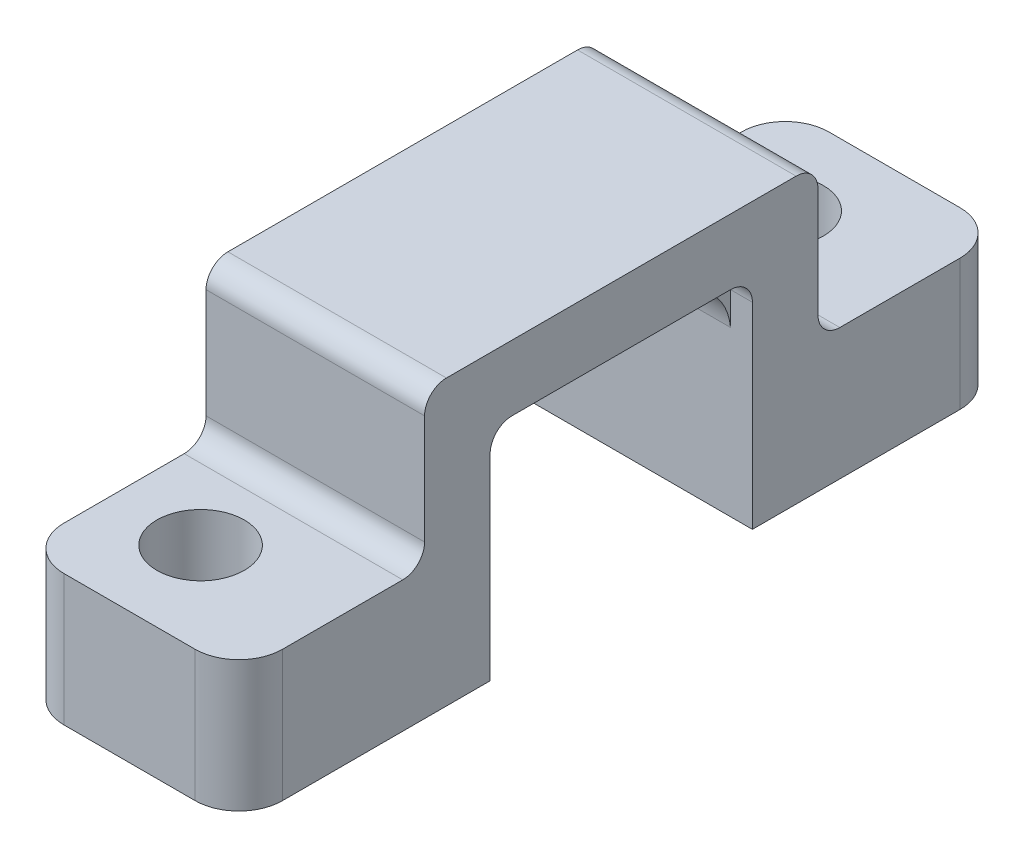
ISO-10303-21;
HEADER;
FILE_DESCRIPTION(('STEP AP214'),'2;1');
FILE_NAME('part.step','',(''),(''),'','','');
FILE_SCHEMA(('AUTOMOTIVE_DESIGN { 1 0 10303 214 1 1 1 1 }'));
ENDSEC;
DATA;
#1=APPLICATION_CONTEXT('core data for automotive mechanical design processes');
#2=APPLICATION_PROTOCOL_DEFINITION('international standard','automotive_design',2000,#1);
#3=PRODUCT_CONTEXT('',#1,'mechanical');
#4=PRODUCT('Part','Part','',(#3));
#5=PRODUCT_RELATED_PRODUCT_CATEGORY('part','',(#4));
#6=PRODUCT_DEFINITION_FORMATION('','',#4);
#7=PRODUCT_DEFINITION_CONTEXT('part definition',#1,'design');
#8=PRODUCT_DEFINITION('design','',#6,#7);
#9=PRODUCT_DEFINITION_SHAPE('','',#8);
#10=(LENGTH_UNIT() NAMED_UNIT(*) SI_UNIT(.MILLI.,.METRE.));
#11=(NAMED_UNIT(*) PLANE_ANGLE_UNIT() SI_UNIT($,.RADIAN.));
#12=(NAMED_UNIT(*) SI_UNIT($,.STERADIAN.) SOLID_ANGLE_UNIT());
#13=UNCERTAINTY_MEASURE_WITH_UNIT(LENGTH_MEASURE(1.E-05),#10,'distance_accuracy_value','');
#14=(GEOMETRIC_REPRESENTATION_CONTEXT(3) GLOBAL_UNCERTAINTY_ASSIGNED_CONTEXT((#13)) GLOBAL_UNIT_ASSIGNED_CONTEXT((#10,
#11,#12)) REPRESENTATION_CONTEXT('',''));
#15=CARTESIAN_POINT('',(0.,0.,0.));
#16=DIRECTION('',(0.,0.,1.));
#17=DIRECTION('',(1.,0.,0.));
#18=AXIS2_PLACEMENT_3D('',#15,#16,#17);
#19=CARTESIAN_POINT('',(-5.,10.,-14.));
#20=DIRECTION('',(0.,1.,0.));
#21=DIRECTION('',(0.,0.,1.));
#22=AXIS2_PLACEMENT_3D('',#19,#20,#21);
#23=PLANE('',#22);
#24=DIRECTION('',(0.,0.,-1.));
#25=VECTOR('',#24,1.);
#26=CARTESIAN_POINT('',(0.,10.,0.));
#27=LINE('',#26,#25);
#28=CARTESIAN_POINT('',(0.,10.,-3.46480602147619));
#29=VERTEX_POINT('',#28);
#30=CARTESIAN_POINT('',(0.,10.,-5.));
#31=VERTEX_POINT('',#30);
#32=EDGE_CURVE('E309',#29,#31,#27,.T.);
#33=ORIENTED_EDGE('',*,*,#32,.F.);
#34=DIRECTION('',(1.,0.,0.));
#35=VECTOR('',#34,1.);
#36=CARTESIAN_POINT('',(0.,10.,-3.46480602147619));
#37=LINE('',#36,#35);
#38=CARTESIAN_POINT('',(4.,10.,-3.46480602147619));
#39=VERTEX_POINT('',#38);
#40=EDGE_CURVE('E318',#29,#39,#37,.T.);
#41=ORIENTED_EDGE('',*,*,#40,.T.);
#42=DIRECTION('',(0.,0.,-1.));
#43=VECTOR('',#42,1.);
#44=CARTESIAN_POINT('',(4.,10.,0.));
#45=LINE('',#44,#43);
#46=CARTESIAN_POINT('',(4.,10.,-5.));
#47=VERTEX_POINT('',#46);
#48=EDGE_CURVE('E306',#39,#47,#45,.T.);
#49=ORIENTED_EDGE('',*,*,#48,.T.);
#50=DIRECTION('',(-1.,0.,0.));
#51=VECTOR('',#50,1.);
#52=CARTESIAN_POINT('',(5.,10.,-5.));
#53=LINE('',#52,#51);
#54=CARTESIAN_POINT('',(5.,10.,-5.));
#55=VERTEX_POINT('',#54);
#56=EDGE_CURVE('E385',#47,#55,#53,.F.);
#57=ORIENTED_EDGE('',*,*,#56,.T.);
#58=DIRECTION('',(0.,0.,1.));
#59=VECTOR('',#58,1.);
#60=CARTESIAN_POINT('',(5.,10.,-14.));
#61=LINE('',#60,#59);
#62=CARTESIAN_POINT('',(5.,10.,5.));
#63=VERTEX_POINT('',#62);
#64=EDGE_CURVE('E354',#55,#63,#61,.T.);
#65=ORIENTED_EDGE('',*,*,#64,.T.);
#66=DIRECTION('',(-1.,0.,0.));
#67=VECTOR('',#66,1.);
#68=CARTESIAN_POINT('',(-5.,10.,5.));
#69=LINE('',#68,#67);
#70=CARTESIAN_POINT('',(4.,10.,5.));
#71=VERTEX_POINT('',#70);
#72=EDGE_CURVE('E382',#63,#71,#69,.T.);
#73=ORIENTED_EDGE('',*,*,#72,.T.);
#74=DIRECTION('',(0.,0.,-1.));
#75=VECTOR('',#74,1.);
#76=CARTESIAN_POINT('',(4.,10.,0.));
#77=LINE('',#76,#75);
#78=CARTESIAN_POINT('',(4.,10.,3.46480602147619));
#79=VERTEX_POINT('',#78);
#80=EDGE_CURVE('E326',#71,#79,#77,.T.);
#81=ORIENTED_EDGE('',*,*,#80,.T.);
#82=DIRECTION('',(1.,0.,0.));
#83=VECTOR('',#82,1.);
#84=CARTESIAN_POINT('',(0.,10.,3.46480602147619));
#85=LINE('',#84,#83);
#86=CARTESIAN_POINT('',(0.,10.,3.46480602147619));
#87=VERTEX_POINT('',#86);
#88=EDGE_CURVE('E339',#87,#79,#85,.T.);
#89=ORIENTED_EDGE('',*,*,#88,.F.);
#90=DIRECTION('',(0.,0.,-1.));
#91=VECTOR('',#90,1.);
#92=CARTESIAN_POINT('',(0.,10.,0.));
#93=LINE('',#92,#91);
#94=CARTESIAN_POINT('',(0.,10.,5.));
#95=VERTEX_POINT('',#94);
#96=EDGE_CURVE('E329',#95,#87,#93,.T.);
#97=ORIENTED_EDGE('',*,*,#96,.F.);
#98=CARTESIAN_POINT('',(-5.,10.,5.));
#99=VERTEX_POINT('',#98);
#100=EDGE_CURVE('E381',#95,#99,#69,.T.);
#101=ORIENTED_EDGE('',*,*,#100,.T.);
#102=DIRECTION('',(0.,0.,1.));
#103=VECTOR('',#102,1.);
#104=CARTESIAN_POINT('',(-5.,10.,-14.));
#105=LINE('',#104,#103);
#106=CARTESIAN_POINT('',(-5.,10.,-5.));
#107=VERTEX_POINT('',#106);
#108=EDGE_CURVE('E357',#107,#99,#105,.T.);
#109=ORIENTED_EDGE('',*,*,#108,.F.);
#110=EDGE_CURVE('E386',#107,#31,#53,.F.);
#111=ORIENTED_EDGE('',*,*,#110,.T.);
#112=EDGE_LOOP('',(#33,#41,#49,#57,#65,#73,#81,#89,#97,#101,#109,#111));
#113=FACE_BOUND('',#112,.T.);
#114=ADVANCED_FACE('F39',(#113),#23,.F.);
#115=CARTESIAN_POINT('',(-5.,0.,-6.));
#116=DIRECTION('',(0.,0.,-1.));
#117=DIRECTION('',(-1.,0.,0.));
#118=AXIS2_PLACEMENT_3D('',#115,#116,#117);
#119=PLANE('',#118);
#120=DIRECTION('',(0.,1.,0.));
#121=VECTOR('',#120,1.);
#122=CARTESIAN_POINT('',(-5.,0.,-6.));
#123=LINE('',#122,#121);
#124=CARTESIAN_POINT('',(-5.,0.,-6.));
#125=VERTEX_POINT('',#124);
#126=CARTESIAN_POINT('',(-5.,9.,-6.));
#127=VERTEX_POINT('',#126);
#128=EDGE_CURVE('E348',#125,#127,#123,.T.);
#129=ORIENTED_EDGE('',*,*,#128,.F.);
#130=DIRECTION('',(-1.,0.,0.));
#131=VECTOR('',#130,1.);
#132=CARTESIAN_POINT('',(-5.,0.,-6.));
#133=LINE('',#132,#131);
#134=CARTESIAN_POINT('',(5.,0.,-6.));
#135=VERTEX_POINT('',#134);
#136=EDGE_CURVE('E345',#135,#125,#133,.T.);
#137=ORIENTED_EDGE('',*,*,#136,.F.);
#138=DIRECTION('',(0.,1.,0.));
#139=VECTOR('',#138,1.);
#140=CARTESIAN_POINT('',(5.,0.,-6.));
#141=LINE('',#140,#139);
#142=CARTESIAN_POINT('',(5.,9.,-6.));
#143=VERTEX_POINT('',#142);
#144=EDGE_CURVE('E351',#135,#143,#141,.T.);
#145=ORIENTED_EDGE('',*,*,#144,.T.);
#146=DIRECTION('',(-1.,0.,0.));
#147=VECTOR('',#146,1.);
#148=CARTESIAN_POINT('',(-5.,9.,-6.));
#149=LINE('',#148,#147);
#150=CARTESIAN_POINT('',(4.,9.,-6.));
#151=VERTEX_POINT('',#150);
#152=EDGE_CURVE('E378',#143,#151,#149,.T.);
#153=ORIENTED_EDGE('',*,*,#152,.T.);
#154=DIRECTION('',(0.,1.,0.));
#155=VECTOR('',#154,1.);
#156=CARTESIAN_POINT('',(4.,0.,-6.));
#157=LINE('',#156,#155);
#158=CARTESIAN_POINT('',(4.,7.5,-6.));
#159=VERTEX_POINT('',#158);
#160=EDGE_CURVE('E314',#159,#151,#157,.T.);
#161=ORIENTED_EDGE('',*,*,#160,.F.);
#162=DIRECTION('',(1.,0.,0.));
#163=VECTOR('',#162,1.);
#164=CARTESIAN_POINT('',(0.,7.5,-6.));
#165=LINE('',#164,#163);
#166=CARTESIAN_POINT('',(0.,7.5,-6.));
#167=VERTEX_POINT('',#166);
#168=EDGE_CURVE('E311',#167,#159,#165,.T.);
#169=ORIENTED_EDGE('',*,*,#168,.F.);
#170=DIRECTION('',(0.,1.,0.));
#171=VECTOR('',#170,1.);
#172=CARTESIAN_POINT('',(0.,0.,-6.));
#173=LINE('',#172,#171);
#174=CARTESIAN_POINT('',(0.,9.,-6.));
#175=VERTEX_POINT('',#174);
#176=EDGE_CURVE('E305',#167,#175,#173,.T.);
#177=ORIENTED_EDGE('',*,*,#176,.T.);
#178=EDGE_CURVE('E376',#175,#127,#149,.T.);
#179=ORIENTED_EDGE('',*,*,#178,.T.);
#180=EDGE_LOOP('',(#129,#137,#145,#153,#161,#169,#177,#179));
#181=FACE_BOUND('',#180,.T.);
#182=ADVANCED_FACE('F519',(#181),#119,.F.);
#183=CARTESIAN_POINT('',(-5.,9.,-5.));
#184=DIRECTION('',(1.,0.,0.));
#185=DIRECTION('',(0.,0.,-1.));
#186=AXIS2_PLACEMENT_3D('',#183,#184,#185);
#187=CYLINDRICAL_SURFACE('',#186,1.);
#188=CARTESIAN_POINT('',(0.,9.,-5.));
#189=DIRECTION('',(1.,0.,0.));
#190=DIRECTION('',(0.,0.,-1.));
#191=AXIS2_PLACEMENT_3D('',#188,#189,#190);
#192=CIRCLE('',#191,1.);
#193=EDGE_CURVE('E428',#31,#175,#192,.F.);
#194=ORIENTED_EDGE('',*,*,#193,.F.);
#195=ORIENTED_EDGE('',*,*,#110,.F.);
#196=CARTESIAN_POINT('',(-5.,9.,-5.));
#197=DIRECTION('',(1.,0.,0.));
#198=DIRECTION('',(0.,0.,-1.));
#199=AXIS2_PLACEMENT_3D('',#196,#197,#198);
#200=CIRCLE('',#199,1.);
#201=EDGE_CURVE('E412',#127,#107,#200,.T.);
#202=ORIENTED_EDGE('',*,*,#201,.F.);
#203=ORIENTED_EDGE('',*,*,#178,.F.);
#204=EDGE_LOOP('',(#194,#195,#202,#203));
#205=FACE_BOUND('',#204,.T.);
#206=ADVANCED_FACE('F569',(#205),#187,.F.);
#207=CARTESIAN_POINT('',(0.,0.,6.));
#208=DIRECTION('',(0.,0.,-1.));
#209=DIRECTION('',(-1.,0.,0.));
#210=AXIS2_PLACEMENT_3D('',#207,#208,#209);
#211=PLANE('',#210);
#212=DIRECTION('',(-1.,0.,0.));
#213=VECTOR('',#212,1.);
#214=CARTESIAN_POINT('',(5.,0.,6.));
#215=LINE('',#214,#213);
#216=CARTESIAN_POINT('',(5.,0.,6.));
#217=VERTEX_POINT('',#216);
#218=CARTESIAN_POINT('',(-5.,0.,6.));
#219=VERTEX_POINT('',#218);
#220=EDGE_CURVE('E369',#217,#219,#215,.T.);
#221=ORIENTED_EDGE('',*,*,#220,.T.);
#222=DIRECTION('',(0.,1.,0.));
#223=VECTOR('',#222,1.);
#224=CARTESIAN_POINT('',(-5.,3.,6.));
#225=LINE('',#224,#223);
#226=CARTESIAN_POINT('',(-5.,9.,6.));
#227=VERTEX_POINT('',#226);
#228=EDGE_CURVE('E360',#219,#227,#225,.T.);
#229=ORIENTED_EDGE('',*,*,#228,.T.);
#230=DIRECTION('',(-1.,0.,0.));
#231=VECTOR('',#230,1.);
#232=CARTESIAN_POINT('',(0.,9.,6.));
#233=LINE('',#232,#231);
#234=CARTESIAN_POINT('',(0.,9.,6.));
#235=VERTEX_POINT('',#234);
#236=EDGE_CURVE('E409',#227,#235,#233,.F.);
#237=ORIENTED_EDGE('',*,*,#236,.T.);
#238=DIRECTION('',(0.,1.,0.));
#239=VECTOR('',#238,1.);
#240=CARTESIAN_POINT('',(0.,0.,6.));
#241=LINE('',#240,#239);
#242=CARTESIAN_POINT('',(0.,7.5,6.));
#243=VERTEX_POINT('',#242);
#244=EDGE_CURVE('E323',#243,#235,#241,.T.);
#245=ORIENTED_EDGE('',*,*,#244,.F.);
#246=DIRECTION('',(1.,0.,0.));
#247=VECTOR('',#246,1.);
#248=CARTESIAN_POINT('',(0.,7.5,6.));
#249=LINE('',#248,#247);
#250=CARTESIAN_POINT('',(4.,7.5,6.));
#251=VERTEX_POINT('',#250);
#252=EDGE_CURVE('E331',#243,#251,#249,.T.);
#253=ORIENTED_EDGE('',*,*,#252,.T.);
#254=DIRECTION('',(0.,1.,0.));
#255=VECTOR('',#254,1.);
#256=CARTESIAN_POINT('',(4.,0.,6.));
#257=LINE('',#256,#255);
#258=CARTESIAN_POINT('',(4.,9.,6.));
#259=VERTEX_POINT('',#258);
#260=EDGE_CURVE('E321',#251,#259,#257,.T.);
#261=ORIENTED_EDGE('',*,*,#260,.T.);
#262=CARTESIAN_POINT('',(5.,9.,6.));
#263=VERTEX_POINT('',#262);
#264=EDGE_CURVE('E408',#259,#263,#233,.F.);
#265=ORIENTED_EDGE('',*,*,#264,.T.);
#266=DIRECTION('',(0.,-1.,0.));
#267=VECTOR('',#266,1.);
#268=CARTESIAN_POINT('',(5.,13.,6.));
#269=LINE('',#268,#267);
#270=EDGE_CURVE('E366',#263,#217,#269,.T.);
#271=ORIENTED_EDGE('',*,*,#270,.T.);
#272=EDGE_LOOP('',(#221,#229,#237,#245,#253,#261,#265,#271));
#273=FACE_BOUND('',#272,.T.);
#274=ADVANCED_FACE('F503',(#273),#211,.T.);
#275=CARTESIAN_POINT('',(-5.,9.,5.));
#276=DIRECTION('',(-1.,0.,0.));
#277=DIRECTION('',(0.,0.,1.));
#278=AXIS2_PLACEMENT_3D('',#275,#276,#277);
#279=CYLINDRICAL_SURFACE('',#278,1.);
#280=CARTESIAN_POINT('',(0.,9.,5.));
#281=DIRECTION('',(1.,0.,0.));
#282=DIRECTION('',(0.,0.,-1.));
#283=AXIS2_PLACEMENT_3D('',#280,#281,#282);
#284=CIRCLE('',#283,1.);
#285=EDGE_CURVE('E423',#235,#95,#284,.F.);
#286=ORIENTED_EDGE('',*,*,#285,.F.);
#287=ORIENTED_EDGE('',*,*,#236,.F.);
#288=CARTESIAN_POINT('',(-5.,9.,5.));
#289=DIRECTION('',(1.,0.,0.));
#290=DIRECTION('',(0.,0.,-1.));
#291=AXIS2_PLACEMENT_3D('',#288,#289,#290);
#292=CIRCLE('',#291,1.);
#293=EDGE_CURVE('E416',#99,#227,#292,.T.);
#294=ORIENTED_EDGE('',*,*,#293,.F.);
#295=ORIENTED_EDGE('',*,*,#100,.F.);
#296=EDGE_LOOP('',(#286,#287,#294,#295));
#297=FACE_BOUND('',#296,.T.);
#298=ADVANCED_FACE('F566',(#297),#279,.F.);
#299=CARTESIAN_POINT('',(-5.,3.,6.));
#300=DIRECTION('',(1.,0.,0.));
#301=DIRECTION('',(0.,0.,-1.));
#302=AXIS2_PLACEMENT_3D('',#299,#300,#301);
#303=PLANE('',#302);
#304=CARTESIAN_POINT('',(-5.,12.,-8.));
#305=DIRECTION('',(1.,0.,0.));
#306=DIRECTION('',(0.,0.,-1.));
#307=AXIS2_PLACEMENT_3D('',#304,#305,#306);
#308=CIRCLE('',#307,1.);
#309=CARTESIAN_POINT('',(-5.,13.,-8.));
#310=VERTEX_POINT('',#309);
#311=CARTESIAN_POINT('',(-5.,12.,-9.));
#312=VERTEX_POINT('',#311);
#313=EDGE_CURVE('E391',#310,#312,#308,.F.);
#314=ORIENTED_EDGE('',*,*,#313,.T.);
#315=DIRECTION('',(0.,1.,0.));
#316=VECTOR('',#315,1.);
#317=CARTESIAN_POINT('',(-5.,6.,-9.));
#318=LINE('',#317,#316);
#319=CARTESIAN_POINT('',(-5.,7.,-9.));
#320=VERTEX_POINT('',#319);
#321=EDGE_CURVE('E538',#320,#312,#318,.T.);
#322=ORIENTED_EDGE('',*,*,#321,.F.);
#323=CARTESIAN_POINT('',(-5.,7.,-10.));
#324=DIRECTION('',(1.,0.,0.));
#325=DIRECTION('',(0.,0.,-1.));
#326=AXIS2_PLACEMENT_3D('',#323,#324,#325);
#327=CIRCLE('',#326,1.);
#328=CARTESIAN_POINT('',(-5.,6.,-10.));
#329=VERTEX_POINT('',#328);
#330=EDGE_CURVE('E47',#320,#329,#327,.T.);
#331=ORIENTED_EDGE('',*,*,#330,.T.);
#332=DIRECTION('',(0.,0.,1.));
#333=VECTOR('',#332,1.);
#334=CARTESIAN_POINT('',(-5.,6.,-9.));
#335=LINE('',#334,#333);
#336=CARTESIAN_POINT('',(-5.,6.,-15.5));
#337=VERTEX_POINT('',#336);
#338=EDGE_CURVE('E246',#337,#329,#335,.T.);
#339=ORIENTED_EDGE('',*,*,#338,.F.);
#340=DIRECTION('',(0.,1.,0.));
#341=VECTOR('',#340,1.);
#342=CARTESIAN_POINT('',(-5.,0.,-15.5));
#343=LINE('',#342,#341);
#344=CARTESIAN_POINT('',(-5.,0.,-15.5));
#345=VERTEX_POINT('',#344);
#346=EDGE_CURVE('E285',#345,#337,#343,.T.);
#347=ORIENTED_EDGE('',*,*,#346,.F.);
#348=DIRECTION('',(0.,0.,1.));
#349=VECTOR('',#348,1.);
#350=CARTESIAN_POINT('',(-5.,0.,-28.));
#351=LINE('',#350,#349);
#352=EDGE_CURVE('E289',#345,#125,#351,.T.);
#353=ORIENTED_EDGE('',*,*,#352,.T.);
#354=ORIENTED_EDGE('',*,*,#128,.T.);
#355=ORIENTED_EDGE('',*,*,#201,.T.);
#356=ORIENTED_EDGE('',*,*,#108,.T.);
#357=ORIENTED_EDGE('',*,*,#293,.T.);
#358=ORIENTED_EDGE('',*,*,#228,.F.);
#359=DIRECTION('',(0.,0.,1.));
#360=VECTOR('',#359,1.);
#361=CARTESIAN_POINT('',(-5.,0.,14.));
#362=LINE('',#361,#360);
#363=CARTESIAN_POINT('',(-5.,0.,15.5));
#364=VERTEX_POINT('',#363);
#365=EDGE_CURVE('E300',#219,#364,#362,.T.);
#366=ORIENTED_EDGE('',*,*,#365,.T.);
#367=DIRECTION('',(0.,1.,0.));
#368=VECTOR('',#367,1.);
#369=CARTESIAN_POINT('',(-5.,0.,15.5));
#370=LINE('',#369,#368);
#371=CARTESIAN_POINT('',(-5.,5.99999999999998,15.5));
#372=VERTEX_POINT('',#371);
#373=EDGE_CURVE('E269',#364,#372,#370,.T.);
#374=ORIENTED_EDGE('',*,*,#373,.T.);
#375=DIRECTION('',(0.,0.,1.));
#376=VECTOR('',#375,1.);
#377=CARTESIAN_POINT('',(-5.,5.99999999999999,9.));
#378=LINE('',#377,#376);
#379=CARTESIAN_POINT('',(-5.,5.99999999999999,10.));
#380=VERTEX_POINT('',#379);
#381=EDGE_CURVE('E247',#380,#372,#378,.T.);
#382=ORIENTED_EDGE('',*,*,#381,.F.);
#383=CARTESIAN_POINT('',(-5.,6.99999999999999,10.));
#384=DIRECTION('',(1.,0.,0.));
#385=DIRECTION('',(0.,0.,-1.));
#386=AXIS2_PLACEMENT_3D('',#383,#384,#385);
#387=CIRCLE('',#386,1.);
#388=CARTESIAN_POINT('',(-5.,6.99999999999999,9.));
#389=VERTEX_POINT('',#388);
#390=EDGE_CURVE('E448',#380,#389,#387,.T.);
#391=ORIENTED_EDGE('',*,*,#390,.T.);
#392=DIRECTION('',(0.,-1.,0.));
#393=VECTOR('',#392,1.);
#394=CARTESIAN_POINT('',(-5.,5.99999999999999,9.));
#395=LINE('',#394,#393);
#396=CARTESIAN_POINT('',(-5.,12.,9.));
#397=VERTEX_POINT('',#396);
#398=EDGE_CURVE('E465',#397,#389,#395,.T.);
#399=ORIENTED_EDGE('',*,*,#398,.F.);
#400=CARTESIAN_POINT('',(-5.,12.,8.));
#401=DIRECTION('',(1.,0.,0.));
#402=DIRECTION('',(0.,0.,-1.));
#403=AXIS2_PLACEMENT_3D('',#400,#401,#402);
#404=CIRCLE('',#403,1.);
#405=CARTESIAN_POINT('',(-5.,13.,8.));
#406=VERTEX_POINT('',#405);
#407=EDGE_CURVE('E394',#397,#406,#404,.F.);
#408=ORIENTED_EDGE('',*,*,#407,.T.);
#409=DIRECTION('',(0.,0.,1.));
#410=VECTOR('',#409,1.);
#411=CARTESIAN_POINT('',(-5.,13.,6.));
#412=LINE('',#411,#410);
#413=EDGE_CURVE('E363',#310,#406,#412,.T.);
#414=ORIENTED_EDGE('',*,*,#413,.F.);
#415=EDGE_LOOP('',(#314,#322,#331,#339,#347,#353,#354,#355,#356,#357,#358,#366,#374,#382,#391,
#399,#408,#414));
#416=FACE_BOUND('',#415,.T.);
#417=ADVANCED_FACE('F464',(#416),#303,.F.);
#418=CARTESIAN_POINT('',(5.,13.,14.));
#419=DIRECTION('',(1.,0.,0.));
#420=DIRECTION('',(0.,0.,-1.));
#421=AXIS2_PLACEMENT_3D('',#418,#419,#420);
#422=PLANE('',#421);
#423=DIRECTION('',(0.,-1.,0.));
#424=VECTOR('',#423,1.);
#425=CARTESIAN_POINT('',(5.,13.,-9.));
#426=LINE('',#425,#424);
#427=CARTESIAN_POINT('',(5.,12.,-9.));
#428=VERTEX_POINT('',#427);
#429=CARTESIAN_POINT('',(5.,7.,-9.));
#430=VERTEX_POINT('',#429);
#431=EDGE_CURVE('E482',#428,#430,#426,.T.);
#432=ORIENTED_EDGE('',*,*,#431,.F.);
#433=CARTESIAN_POINT('',(5.,12.,-8.));
#434=DIRECTION('',(1.,0.,0.));
#435=DIRECTION('',(0.,0.,-1.));
#436=AXIS2_PLACEMENT_3D('',#433,#434,#435);
#437=CIRCLE('',#436,1.);
#438=CARTESIAN_POINT('',(5.,13.,-8.));
#439=VERTEX_POINT('',#438);
#440=EDGE_CURVE('E401',#428,#439,#437,.T.);
#441=ORIENTED_EDGE('',*,*,#440,.T.);
#442=DIRECTION('',(0.,0.,-1.));
#443=VECTOR('',#442,1.);
#444=CARTESIAN_POINT('',(5.,13.,14.));
#445=LINE('',#444,#443);
#446=CARTESIAN_POINT('',(5.,13.,8.));
#447=VERTEX_POINT('',#446);
#448=EDGE_CURVE('E373',#447,#439,#445,.T.);
#449=ORIENTED_EDGE('',*,*,#448,.F.);
#450=CARTESIAN_POINT('',(5.,12.,8.));
#451=DIRECTION('',(1.,0.,0.));
#452=DIRECTION('',(0.,0.,-1.));
#453=AXIS2_PLACEMENT_3D('',#450,#451,#452);
#454=CIRCLE('',#453,1.);
#455=CARTESIAN_POINT('',(5.,12.,9.));
#456=VERTEX_POINT('',#455);
#457=EDGE_CURVE('E403',#447,#456,#454,.T.);
#458=ORIENTED_EDGE('',*,*,#457,.T.);
#459=DIRECTION('',(0.,1.,0.));
#460=VECTOR('',#459,1.);
#461=CARTESIAN_POINT('',(5.,13.,9.));
#462=LINE('',#461,#460);
#463=CARTESIAN_POINT('',(5.,6.99999999999999,9.));
#464=VERTEX_POINT('',#463);
#465=EDGE_CURVE('E439',#464,#456,#462,.T.);
#466=ORIENTED_EDGE('',*,*,#465,.F.);
#467=CARTESIAN_POINT('',(5.,6.99999999999999,10.));
#468=DIRECTION('',(1.,0.,0.));
#469=DIRECTION('',(0.,0.,-1.));
#470=AXIS2_PLACEMENT_3D('',#467,#468,#469);
#471=CIRCLE('',#470,1.);
#472=CARTESIAN_POINT('',(5.,5.99999999999999,10.));
#473=VERTEX_POINT('',#472);
#474=EDGE_CURVE('E450',#464,#473,#471,.F.);
#475=ORIENTED_EDGE('',*,*,#474,.T.);
#476=DIRECTION('',(0.,0.,-1.));
#477=VECTOR('',#476,1.);
#478=CARTESIAN_POINT('',(5.,5.99999999999998,14.));
#479=LINE('',#478,#477);
#480=CARTESIAN_POINT('',(5.,5.99999999999998,15.5));
#481=VERTEX_POINT('',#480);
#482=EDGE_CURVE('E257',#481,#473,#479,.T.);
#483=ORIENTED_EDGE('',*,*,#482,.F.);
#484=DIRECTION('',(0.,1.,0.));
#485=VECTOR('',#484,1.);
#486=CARTESIAN_POINT('',(5.,0.,15.5));
#487=LINE('',#486,#485);
#488=CARTESIAN_POINT('',(5.,0.,15.5));
#489=VERTEX_POINT('',#488);
#490=EDGE_CURVE('E256',#489,#481,#487,.T.);
#491=ORIENTED_EDGE('',*,*,#490,.F.);
#492=DIRECTION('',(0.,0.,-1.));
#493=VECTOR('',#492,1.);
#494=CARTESIAN_POINT('',(5.,0.,14.));
#495=LINE('',#494,#493);
#496=EDGE_CURVE('E372',#489,#217,#495,.T.);
#497=ORIENTED_EDGE('',*,*,#496,.T.);
#498=ORIENTED_EDGE('',*,*,#270,.F.);
#499=CARTESIAN_POINT('',(5.,9.,5.));
#500=DIRECTION('',(1.,0.,0.));
#501=DIRECTION('',(0.,0.,-1.));
#502=AXIS2_PLACEMENT_3D('',#499,#500,#501);
#503=CIRCLE('',#502,1.);
#504=EDGE_CURVE('E418',#263,#63,#503,.F.);
#505=ORIENTED_EDGE('',*,*,#504,.T.);
#506=ORIENTED_EDGE('',*,*,#64,.F.);
#507=CARTESIAN_POINT('',(5.,9.,-5.));
#508=DIRECTION('',(1.,0.,0.));
#509=DIRECTION('',(0.,0.,-1.));
#510=AXIS2_PLACEMENT_3D('',#507,#508,#509);
#511=CIRCLE('',#510,1.);
#512=EDGE_CURVE('E414',#55,#143,#511,.F.);
#513=ORIENTED_EDGE('',*,*,#512,.T.);
#514=ORIENTED_EDGE('',*,*,#144,.F.);
#515=DIRECTION('',(0.,0.,1.));
#516=VECTOR('',#515,1.);
#517=CARTESIAN_POINT('',(5.,0.,-6.));
#518=LINE('',#517,#516);
#519=CARTESIAN_POINT('',(4.99999999999999,0.,-15.5));
#520=VERTEX_POINT('',#519);
#521=EDGE_CURVE('E341',#520,#135,#518,.T.);
#522=ORIENTED_EDGE('',*,*,#521,.F.);
#523=DIRECTION('',(0.,1.,0.));
#524=VECTOR('',#523,1.);
#525=CARTESIAN_POINT('',(4.99999999999999,0.,-15.5));
#526=LINE('',#525,#524);
#527=CARTESIAN_POINT('',(4.99999999999999,6.,-15.5));
#528=VERTEX_POINT('',#527);
#529=EDGE_CURVE('E293',#520,#528,#526,.T.);
#530=ORIENTED_EDGE('',*,*,#529,.T.);
#531=DIRECTION('',(0.,0.,-1.));
#532=VECTOR('',#531,1.);
#533=CARTESIAN_POINT('',(5.,6.,14.));
#534=LINE('',#533,#532);
#535=CARTESIAN_POINT('',(5.,6.,-10.));
#536=VERTEX_POINT('',#535);
#537=EDGE_CURVE('E478',#536,#528,#534,.T.);
#538=ORIENTED_EDGE('',*,*,#537,.F.);
#539=CARTESIAN_POINT('',(5.,7.,-10.));
#540=DIRECTION('',(1.,0.,0.));
#541=DIRECTION('',(0.,0.,-1.));
#542=AXIS2_PLACEMENT_3D('',#539,#540,#541);
#543=CIRCLE('',#542,1.);
#544=EDGE_CURVE('E11',#536,#430,#543,.F.);
#545=ORIENTED_EDGE('',*,*,#544,.T.);
#546=EDGE_LOOP('',(#432,#441,#449,#458,#466,#475,#483,#491,#497,#498,#505,#506,#513,#514,#522,
#530,#538,#545));
#547=FACE_BOUND('',#546,.T.);
#548=ADVANCED_FACE('F455',(#547),#422,.T.);
#549=CARTESIAN_POINT('',(-13.5,13.,14.));
#550=DIRECTION('',(0.,1.,0.));
#551=DIRECTION('',(0.,0.,1.));
#552=AXIS2_PLACEMENT_3D('',#549,#550,#551);
#553=PLANE('',#552);
#554=ORIENTED_EDGE('',*,*,#413,.T.);
#555=DIRECTION('',(-1.,0.,0.));
#556=VECTOR('',#555,1.);
#557=CARTESIAN_POINT('',(5.,13.,8.));
#558=LINE('',#557,#556);
#559=EDGE_CURVE('E399',#406,#447,#558,.F.);
#560=ORIENTED_EDGE('',*,*,#559,.T.);
#561=ORIENTED_EDGE('',*,*,#448,.T.);
#562=DIRECTION('',(-1.,0.,0.));
#563=VECTOR('',#562,1.);
#564=CARTESIAN_POINT('',(-5.,13.,-8.));
#565=LINE('',#564,#563);
#566=EDGE_CURVE('E396',#439,#310,#565,.T.);
#567=ORIENTED_EDGE('',*,*,#566,.T.);
#568=EDGE_LOOP('',(#554,#560,#561,#567));
#569=FACE_BOUND('',#568,.T.);
#570=ADVANCED_FACE('F553',(#569),#553,.T.);
#571=CARTESIAN_POINT('',(5.,0.,14.));
#572=DIRECTION('',(0.,-1.,0.));
#573=DIRECTION('',(0.,0.,-1.));
#574=AXIS2_PLACEMENT_3D('',#571,#572,#573);
#575=PLANE('',#574);
#576=ORIENTED_EDGE('',*,*,#496,.F.);
#577=CARTESIAN_POINT('',(3.,0.,15.5));
#578=DIRECTION('',(0.,1.,0.));
#579=DIRECTION('',(0.,0.,-1.));
#580=AXIS2_PLACEMENT_3D('',#577,#578,#579);
#581=CIRCLE('',#580,2.);
#582=CARTESIAN_POINT('',(2.99999999999999,0.,17.5));
#583=VERTEX_POINT('',#582);
#584=EDGE_CURVE('E488',#583,#489,#581,.T.);
#585=ORIENTED_EDGE('',*,*,#584,.F.);
#586=DIRECTION('',(1.,0.,0.));
#587=VECTOR('',#586,1.);
#588=CARTESIAN_POINT('',(2.99999999999999,0.,17.5));
#589=LINE('',#588,#587);
#590=CARTESIAN_POINT('',(-3.,0.,17.5));
#591=VERTEX_POINT('',#590);
#592=EDGE_CURVE('E262',#591,#583,#589,.T.);
#593=ORIENTED_EDGE('',*,*,#592,.F.);
#594=CARTESIAN_POINT('',(-3.,0.,15.5));
#595=DIRECTION('',(0.,1.,0.));
#596=DIRECTION('',(0.,0.,1.));
#597=AXIS2_PLACEMENT_3D('',#594,#595,#596);
#598=CIRCLE('',#597,2.);
#599=EDGE_CURVE('E489',#364,#591,#598,.T.);
#600=ORIENTED_EDGE('',*,*,#599,.F.);
#601=ORIENTED_EDGE('',*,*,#365,.F.);
#602=ORIENTED_EDGE('',*,*,#220,.F.);
#603=EDGE_LOOP('',(#576,#585,#593,#600,#601,#602));
#604=FACE_BOUND('',#603,.T.);
#605=CARTESIAN_POINT('',(-0.999999999999999,0.,13.25));
#606=DIRECTION('',(0.,1.,0.));
#607=DIRECTION('',(0.,0.,1.));
#608=AXIS2_PLACEMENT_3D('',#605,#606,#607);
#609=CIRCLE('',#608,2.);
#610=CARTESIAN_POINT('',(-0.999999999999999,0.,15.25));
#611=VERTEX_POINT('',#610);
#612=EDGE_CURVE('E485',#611,#611,#609,.T.);
#613=ORIENTED_EDGE('',*,*,#612,.T.);
#614=EDGE_LOOP('',(#613));
#615=FACE_BOUND('',#614,.T.);
#616=ADVANCED_FACE('F497',(#604,#615),#575,.T.);
#617=CARTESIAN_POINT('',(0.,0.,0.));
#618=DIRECTION('',(0.,1.,0.));
#619=DIRECTION('',(0.,0.,1.));
#620=AXIS2_PLACEMENT_3D('',#617,#618,#619);
#621=PLANE('',#620);
#622=ORIENTED_EDGE('',*,*,#136,.T.);
#623=ORIENTED_EDGE('',*,*,#352,.F.);
#624=CARTESIAN_POINT('',(-3.,0.,-15.5));
#625=DIRECTION('',(0.,1.,0.));
#626=DIRECTION('',(0.,0.,-1.));
#627=AXIS2_PLACEMENT_3D('',#624,#625,#626);
#628=CIRCLE('',#627,2.);
#629=CARTESIAN_POINT('',(-2.99999999999999,0.,-17.5));
#630=VERTEX_POINT('',#629);
#631=EDGE_CURVE('E267',#630,#345,#628,.T.);
#632=ORIENTED_EDGE('',*,*,#631,.F.);
#633=DIRECTION('',(-1.,0.,0.));
#634=VECTOR('',#633,1.);
#635=CARTESIAN_POINT('',(2.99999999999998,0.,-17.5));
#636=LINE('',#635,#634);
#637=CARTESIAN_POINT('',(2.99999999999998,0.,-17.5));
#638=VERTEX_POINT('',#637);
#639=EDGE_CURVE('E282',#638,#630,#636,.T.);
#640=ORIENTED_EDGE('',*,*,#639,.F.);
#641=CARTESIAN_POINT('',(3.,0.,-15.5));
#642=DIRECTION('',(0.,1.,0.));
#643=DIRECTION('',(0.,0.,1.));
#644=AXIS2_PLACEMENT_3D('',#641,#642,#643);
#645=CIRCLE('',#644,2.);
#646=EDGE_CURVE('E279',#520,#638,#645,.T.);
#647=ORIENTED_EDGE('',*,*,#646,.F.);
#648=ORIENTED_EDGE('',*,*,#521,.T.);
#649=EDGE_LOOP('',(#622,#623,#632,#640,#647,#648));
#650=FACE_BOUND('',#649,.T.);
#651=CARTESIAN_POINT('',(-0.999999999999999,0.,-13.25));
#652=DIRECTION('',(0.,1.,0.));
#653=DIRECTION('',(0.,0.,-1.));
#654=AXIS2_PLACEMENT_3D('',#651,#652,#653);
#655=CIRCLE('',#654,2.);
#656=CARTESIAN_POINT('',(-0.999999999999999,0.,-15.25));
#657=VERTEX_POINT('',#656);
#658=EDGE_CURVE('E263',#657,#657,#655,.T.);
#659=ORIENTED_EDGE('',*,*,#658,.T.);
#660=EDGE_LOOP('',(#659));
#661=FACE_BOUND('',#660,.T.);
#662=ADVANCED_FACE('F522',(#650,#661),#621,.F.);
#663=ORIENTED_EDGE('',*,*,#56,.F.);
#664=CARTESIAN_POINT('',(4.,9.,-5.));
#665=DIRECTION('',(1.,0.,0.));
#666=DIRECTION('',(0.,0.,-1.));
#667=AXIS2_PLACEMENT_3D('',#664,#665,#666);
#668=CIRCLE('',#667,1.);
#669=EDGE_CURVE('E425',#47,#151,#668,.F.);
#670=ORIENTED_EDGE('',*,*,#669,.T.);
#671=ORIENTED_EDGE('',*,*,#152,.F.);
#672=ORIENTED_EDGE('',*,*,#512,.F.);
#673=EDGE_LOOP('',(#663,#670,#671,#672));
#674=FACE_BOUND('',#673,.T.);
#675=ADVANCED_FACE('F514',(#674),#187,.F.);
#676=CARTESIAN_POINT('',(5.,12.,8.));
#677=DIRECTION('',(1.,0.,0.));
#678=DIRECTION('',(0.,0.,-1.));
#679=AXIS2_PLACEMENT_3D('',#676,#677,#678);
#680=CYLINDRICAL_SURFACE('',#679,1.);
#681=ORIENTED_EDGE('',*,*,#457,.F.);
#682=ORIENTED_EDGE('',*,*,#559,.F.);
#683=ORIENTED_EDGE('',*,*,#407,.F.);
#684=DIRECTION('',(-1.,0.,0.));
#685=VECTOR('',#684,1.);
#686=CARTESIAN_POINT('',(-5.,12.,9.));
#687=LINE('',#686,#685);
#688=EDGE_CURVE('E389',#456,#397,#687,.T.);
#689=ORIENTED_EDGE('',*,*,#688,.F.);
#690=EDGE_LOOP('',(#681,#682,#683,#689));
#691=FACE_BOUND('',#690,.T.);
#692=ADVANCED_FACE('F557',(#691),#680,.T.);
#693=ORIENTED_EDGE('',*,*,#264,.F.);
#694=CARTESIAN_POINT('',(4.,9.,5.));
#695=DIRECTION('',(1.,0.,0.));
#696=DIRECTION('',(0.,0.,-1.));
#697=AXIS2_PLACEMENT_3D('',#694,#695,#696);
#698=CIRCLE('',#697,1.);
#699=EDGE_CURVE('E420',#259,#71,#698,.F.);
#700=ORIENTED_EDGE('',*,*,#699,.T.);
#701=ORIENTED_EDGE('',*,*,#72,.F.);
#702=ORIENTED_EDGE('',*,*,#504,.F.);
#703=EDGE_LOOP('',(#693,#700,#701,#702));
#704=FACE_BOUND('',#703,.T.);
#705=ADVANCED_FACE('F506',(#704),#279,.F.);
#706=CARTESIAN_POINT('',(-13.5,12.,-8.));
#707=DIRECTION('',(1.,0.,0.));
#708=DIRECTION('',(0.,0.,-1.));
#709=AXIS2_PLACEMENT_3D('',#706,#707,#708);
#710=CYLINDRICAL_SURFACE('',#709,1.);
#711=ORIENTED_EDGE('',*,*,#440,.F.);
#712=DIRECTION('',(-1.,0.,0.));
#713=VECTOR('',#712,1.);
#714=CARTESIAN_POINT('',(5.,12.,-9.));
#715=LINE('',#714,#713);
#716=EDGE_CURVE('E406',#312,#428,#715,.F.);
#717=ORIENTED_EDGE('',*,*,#716,.F.);
#718=ORIENTED_EDGE('',*,*,#313,.F.);
#719=ORIENTED_EDGE('',*,*,#566,.F.);
#720=EDGE_LOOP('',(#711,#717,#718,#719));
#721=FACE_BOUND('',#720,.T.);
#722=ADVANCED_FACE('F548',(#721),#710,.T.);
#723=CARTESIAN_POINT('',(0.,0.,0.));
#724=DIRECTION('',(1.,0.,0.));
#725=DIRECTION('',(0.,0.,-1.));
#726=AXIS2_PLACEMENT_3D('',#723,#724,#725);
#727=PLANE('',#726);
#728=ORIENTED_EDGE('',*,*,#244,.T.);
#729=ORIENTED_EDGE('',*,*,#285,.T.);
#730=ORIENTED_EDGE('',*,*,#96,.T.);
#731=CARTESIAN_POINT('',(0.,7.22888361288571,3.23240301073809));
#732=DIRECTION('',(1.,0.,0.));
#733=DIRECTION('',(0.,0.,-1.));
#734=AXIS2_PLACEMENT_3D('',#731,#732,#733);
#735=CIRCLE('',#734,2.78084469007773);
#736=EDGE_CURVE('E325',#243,#87,#735,.F.);
#737=ORIENTED_EDGE('',*,*,#736,.F.);
#738=EDGE_LOOP('',(#728,#729,#730,#737));
#739=FACE_BOUND('',#738,.T.);
#740=ADVANCED_FACE('F801',(#739),#727,.F.);
#741=CARTESIAN_POINT('',(4.,0.,0.));
#742=DIRECTION('',(1.,0.,0.));
#743=DIRECTION('',(0.,0.,-1.));
#744=AXIS2_PLACEMENT_3D('',#741,#742,#743);
#745=PLANE('',#744);
#746=ORIENTED_EDGE('',*,*,#699,.F.);
#747=ORIENTED_EDGE('',*,*,#260,.F.);
#748=CARTESIAN_POINT('',(4.,7.22888361288571,3.23240301073809));
#749=DIRECTION('',(1.,0.,0.));
#750=DIRECTION('',(0.,0.,-1.));
#751=AXIS2_PLACEMENT_3D('',#748,#749,#750);
#752=CIRCLE('',#751,2.78084469007773);
#753=EDGE_CURVE('E334',#251,#79,#752,.F.);
#754=ORIENTED_EDGE('',*,*,#753,.T.);
#755=ORIENTED_EDGE('',*,*,#80,.F.);
#756=EDGE_LOOP('',(#746,#747,#754,#755));
#757=FACE_BOUND('',#756,.T.);
#758=ADVANCED_FACE('F792',(#757),#745,.T.);
#759=CARTESIAN_POINT('',(0.,7.22888361288571,3.23240301073809));
#760=DIRECTION('',(1.,0.,0.));
#761=DIRECTION('',(0.,0.,-1.));
#762=AXIS2_PLACEMENT_3D('',#759,#760,#761);
#763=CYLINDRICAL_SURFACE('',#762,2.78084469007773);
#764=ORIENTED_EDGE('',*,*,#753,.F.);
#765=ORIENTED_EDGE('',*,*,#252,.F.);
#766=ORIENTED_EDGE('',*,*,#736,.T.);
#767=ORIENTED_EDGE('',*,*,#88,.T.);
#768=EDGE_LOOP('',(#764,#765,#766,#767));
#769=FACE_BOUND('',#768,.T.);
#770=ADVANCED_FACE('F783',(#769),#763,.F.);
#771=CARTESIAN_POINT('',(0.,0.,0.));
#772=DIRECTION('',(1.,0.,0.));
#773=DIRECTION('',(0.,0.,-1.));
#774=AXIS2_PLACEMENT_3D('',#771,#772,#773);
#775=PLANE('',#774);
#776=ORIENTED_EDGE('',*,*,#32,.T.);
#777=ORIENTED_EDGE('',*,*,#193,.T.);
#778=ORIENTED_EDGE('',*,*,#176,.F.);
#779=CARTESIAN_POINT('',(0.,7.22888361288571,-3.23240301073809));
#780=DIRECTION('',(1.,0.,0.));
#781=DIRECTION('',(0.,0.,-1.));
#782=AXIS2_PLACEMENT_3D('',#779,#780,#781);
#783=CIRCLE('',#782,2.78084469007773);
#784=EDGE_CURVE('E303',#167,#29,#783,.T.);
#785=ORIENTED_EDGE('',*,*,#784,.T.);
#786=EDGE_LOOP('',(#776,#777,#778,#785));
#787=FACE_BOUND('',#786,.T.);
#788=ADVANCED_FACE('F774',(#787),#775,.F.);
#789=CARTESIAN_POINT('',(4.,0.,0.));
#790=DIRECTION('',(1.,0.,0.));
#791=DIRECTION('',(0.,0.,-1.));
#792=AXIS2_PLACEMENT_3D('',#789,#790,#791);
#793=PLANE('',#792);
#794=ORIENTED_EDGE('',*,*,#669,.F.);
#795=ORIENTED_EDGE('',*,*,#48,.F.);
#796=CARTESIAN_POINT('',(4.,7.22888361288571,-3.23240301073809));
#797=DIRECTION('',(1.,0.,0.));
#798=DIRECTION('',(0.,0.,-1.));
#799=AXIS2_PLACEMENT_3D('',#796,#797,#798);
#800=CIRCLE('',#799,2.78084469007773);
#801=EDGE_CURVE('E302',#159,#39,#800,.T.);
#802=ORIENTED_EDGE('',*,*,#801,.F.);
#803=ORIENTED_EDGE('',*,*,#160,.T.);
#804=EDGE_LOOP('',(#794,#795,#802,#803));
#805=FACE_BOUND('',#804,.T.);
#806=ADVANCED_FACE('F765',(#805),#793,.T.);
#807=CARTESIAN_POINT('',(0.,7.22888361288571,-3.23240301073809));
#808=DIRECTION('',(1.,0.,0.));
#809=DIRECTION('',(0.,0.,-1.));
#810=AXIS2_PLACEMENT_3D('',#807,#808,#809);
#811=CYLINDRICAL_SURFACE('',#810,2.78084469007773);
#812=ORIENTED_EDGE('',*,*,#801,.T.);
#813=ORIENTED_EDGE('',*,*,#40,.F.);
#814=ORIENTED_EDGE('',*,*,#784,.F.);
#815=ORIENTED_EDGE('',*,*,#168,.T.);
#816=EDGE_LOOP('',(#812,#813,#814,#815));
#817=FACE_BOUND('',#816,.T.);
#818=ADVANCED_FACE('F609',(#817),#811,.F.);
#819=CARTESIAN_POINT('',(-3.,0.,-15.5));
#820=DIRECTION('',(0.,1.,0.));
#821=DIRECTION('',(0.,0.,1.));
#822=AXIS2_PLACEMENT_3D('',#819,#820,#821);
#823=CYLINDRICAL_SURFACE('',#822,2.);
#824=CARTESIAN_POINT('',(-3.,6.,-15.5));
#825=DIRECTION('',(0.,-1.,0.));
#826=DIRECTION('',(0.,0.,-1.));
#827=AXIS2_PLACEMENT_3D('',#824,#825,#826);
#828=CIRCLE('',#827,2.);
#829=CARTESIAN_POINT('',(-2.99999999999999,6.,-17.5));
#830=VERTEX_POINT('',#829);
#831=EDGE_CURVE('E480',#830,#337,#828,.F.);
#832=ORIENTED_EDGE('',*,*,#831,.F.);
#833=DIRECTION('',(0.,1.,0.));
#834=VECTOR('',#833,1.);
#835=CARTESIAN_POINT('',(-2.99999999999999,0.,-17.5));
#836=LINE('',#835,#834);
#837=EDGE_CURVE('E286',#630,#830,#836,.T.);
#838=ORIENTED_EDGE('',*,*,#837,.F.);
#839=ORIENTED_EDGE('',*,*,#631,.T.);
#840=ORIENTED_EDGE('',*,*,#346,.T.);
#841=EDGE_LOOP('',(#832,#838,#839,#840));
#842=FACE_BOUND('',#841,.T.);
#843=ADVANCED_FACE('F605',(#842),#823,.T.);
#844=CARTESIAN_POINT('',(2.99999999999998,0.,-17.5));
#845=DIRECTION('',(0.,0.,-1.));
#846=DIRECTION('',(-1.,0.,0.));
#847=AXIS2_PLACEMENT_3D('',#844,#845,#846);
#848=PLANE('',#847);
#849=DIRECTION('',(-1.,0.,0.));
#850=VECTOR('',#849,1.);
#851=CARTESIAN_POINT('',(20.,6.,-17.5));
#852=LINE('',#851,#850);
#853=CARTESIAN_POINT('',(3.,6.,-17.5));
#854=VERTEX_POINT('',#853);
#855=EDGE_CURVE('E434',#854,#830,#852,.T.);
#856=ORIENTED_EDGE('',*,*,#855,.F.);
#857=DIRECTION('',(0.,1.,0.));
#858=VECTOR('',#857,1.);
#859=CARTESIAN_POINT('',(2.99999999999998,0.,-17.5));
#860=LINE('',#859,#858);
#861=EDGE_CURVE('E290',#638,#854,#860,.T.);
#862=ORIENTED_EDGE('',*,*,#861,.F.);
#863=ORIENTED_EDGE('',*,*,#639,.T.);
#864=ORIENTED_EDGE('',*,*,#837,.T.);
#865=EDGE_LOOP('',(#856,#862,#863,#864));
#866=FACE_BOUND('',#865,.T.);
#867=ADVANCED_FACE('F537',(#866),#848,.T.);
#868=CARTESIAN_POINT('',(3.,0.,-15.5));
#869=DIRECTION('',(0.,1.,0.));
#870=DIRECTION('',(0.,0.,1.));
#871=AXIS2_PLACEMENT_3D('',#868,#869,#870);
#872=CYLINDRICAL_SURFACE('',#871,2.);
#873=CARTESIAN_POINT('',(3.,6.,-15.5));
#874=DIRECTION('',(0.,-1.,0.));
#875=DIRECTION('',(0.,0.,-1.));
#876=AXIS2_PLACEMENT_3D('',#873,#874,#875);
#877=CIRCLE('',#876,2.);
#878=EDGE_CURVE('E438',#528,#854,#877,.F.);
#879=ORIENTED_EDGE('',*,*,#878,.F.);
#880=ORIENTED_EDGE('',*,*,#529,.F.);
#881=ORIENTED_EDGE('',*,*,#646,.T.);
#882=ORIENTED_EDGE('',*,*,#861,.T.);
#883=EDGE_LOOP('',(#879,#880,#881,#882));
#884=FACE_BOUND('',#883,.T.);
#885=ADVANCED_FACE('F531',(#884),#872,.T.);
#886=CARTESIAN_POINT('',(-0.999999999999999,0.,-13.25));
#887=DIRECTION('',(0.,1.,0.));
#888=DIRECTION('',(0.,0.,1.));
#889=AXIS2_PLACEMENT_3D('',#886,#887,#888);
#890=CYLINDRICAL_SURFACE('',#889,2.);
#891=CARTESIAN_POINT('',(-0.999999999999999,6.,-13.25));
#892=DIRECTION('',(0.,-1.,0.));
#893=DIRECTION('',(0.,0.,-1.));
#894=AXIS2_PLACEMENT_3D('',#891,#892,#893);
#895=CIRCLE('',#894,2.);
#896=CARTESIAN_POINT('',(-0.999999999999999,6.,-15.25));
#897=VERTEX_POINT('',#896);
#898=EDGE_CURVE('E435',#897,#897,#895,.F.);
#899=ORIENTED_EDGE('',*,*,#898,.T.);
#900=EDGE_LOOP('',(#899));
#901=FACE_BOUND('',#900,.T.);
#902=ORIENTED_EDGE('',*,*,#658,.F.);
#903=EDGE_LOOP('',(#902));
#904=FACE_BOUND('',#903,.T.);
#905=ADVANCED_FACE('F623',(#901,#904),#890,.F.);
#906=CARTESIAN_POINT('',(3.,0.,15.5));
#907=DIRECTION('',(0.,1.,0.));
#908=DIRECTION('',(0.,0.,1.));
#909=AXIS2_PLACEMENT_3D('',#906,#907,#908);
#910=CYLINDRICAL_SURFACE('',#909,2.);
#911=CARTESIAN_POINT('',(3.,5.99999999999998,15.5));
#912=DIRECTION('',(0.,-1.,0.));
#913=DIRECTION('',(0.,0.,-1.));
#914=AXIS2_PLACEMENT_3D('',#911,#912,#913);
#915=CIRCLE('',#914,2.);
#916=CARTESIAN_POINT('',(2.99999999999999,5.99999999999998,17.5));
#917=VERTEX_POINT('',#916);
#918=EDGE_CURVE('E239',#917,#481,#915,.F.);
#919=ORIENTED_EDGE('',*,*,#918,.F.);
#920=DIRECTION('',(0.,1.,0.));
#921=VECTOR('',#920,1.);
#922=CARTESIAN_POINT('',(2.99999999999999,0.,17.5));
#923=LINE('',#922,#921);
#924=EDGE_CURVE('E253',#583,#917,#923,.T.);
#925=ORIENTED_EDGE('',*,*,#924,.F.);
#926=ORIENTED_EDGE('',*,*,#584,.T.);
#927=ORIENTED_EDGE('',*,*,#490,.T.);
#928=EDGE_LOOP('',(#919,#925,#926,#927));
#929=FACE_BOUND('',#928,.T.);
#930=ADVANCED_FACE('F251',(#929),#910,.T.);
#931=CARTESIAN_POINT('',(2.99999999999999,0.,17.5));
#932=DIRECTION('',(0.,0.,1.));
#933=DIRECTION('',(1.,0.,0.));
#934=AXIS2_PLACEMENT_3D('',#931,#932,#933);
#935=PLANE('',#934);
#936=DIRECTION('',(-1.,0.,0.));
#937=VECTOR('',#936,1.);
#938=CARTESIAN_POINT('',(20.,5.99999999999998,17.5));
#939=LINE('',#938,#937);
#940=CARTESIAN_POINT('',(-3.,5.99999999999998,17.5));
#941=VERTEX_POINT('',#940);
#942=EDGE_CURVE('E234',#917,#941,#939,.T.);
#943=ORIENTED_EDGE('',*,*,#942,.T.);
#944=DIRECTION('',(0.,1.,0.));
#945=VECTOR('',#944,1.);
#946=CARTESIAN_POINT('',(-3.,0.,17.5));
#947=LINE('',#946,#945);
#948=EDGE_CURVE('E264',#591,#941,#947,.T.);
#949=ORIENTED_EDGE('',*,*,#948,.F.);
#950=ORIENTED_EDGE('',*,*,#592,.T.);
#951=ORIENTED_EDGE('',*,*,#924,.T.);
#952=EDGE_LOOP('',(#943,#949,#950,#951));
#953=FACE_BOUND('',#952,.T.);
#954=ADVANCED_FACE('F260',(#953),#935,.T.);
#955=CARTESIAN_POINT('',(-3.,0.,15.5));
#956=DIRECTION('',(0.,1.,0.));
#957=DIRECTION('',(0.,0.,1.));
#958=AXIS2_PLACEMENT_3D('',#955,#956,#957);
#959=CYLINDRICAL_SURFACE('',#958,2.);
#960=CARTESIAN_POINT('',(-3.,5.99999999999998,15.5));
#961=DIRECTION('',(0.,-1.,0.));
#962=DIRECTION('',(0.,0.,-1.));
#963=AXIS2_PLACEMENT_3D('',#960,#961,#962);
#964=CIRCLE('',#963,2.);
#965=EDGE_CURVE('E242',#372,#941,#964,.F.);
#966=ORIENTED_EDGE('',*,*,#965,.F.);
#967=ORIENTED_EDGE('',*,*,#373,.F.);
#968=ORIENTED_EDGE('',*,*,#599,.T.);
#969=ORIENTED_EDGE('',*,*,#948,.T.);
#970=EDGE_LOOP('',(#966,#967,#968,#969));
#971=FACE_BOUND('',#970,.T.);
#972=ADVANCED_FACE('F494',(#971),#959,.T.);
#973=CARTESIAN_POINT('',(-0.999999999999999,0.,13.25));
#974=DIRECTION('',(0.,1.,0.));
#975=DIRECTION('',(0.,0.,1.));
#976=AXIS2_PLACEMENT_3D('',#973,#974,#975);
#977=CYLINDRICAL_SURFACE('',#976,2.);
#978=CARTESIAN_POINT('',(-0.999999999999999,5.99999999999998,13.25));
#979=DIRECTION('',(0.,-1.,0.));
#980=DIRECTION('',(0.,0.,-1.));
#981=AXIS2_PLACEMENT_3D('',#978,#979,#980);
#982=CIRCLE('',#981,2.);
#983=CARTESIAN_POINT('',(-0.999999999999999,5.99999999999999,11.25));
#984=VERTEX_POINT('',#983);
#985=EDGE_CURVE('E431',#984,#984,#982,.F.);
#986=ORIENTED_EDGE('',*,*,#985,.T.);
#987=EDGE_LOOP('',(#986));
#988=FACE_BOUND('',#987,.T.);
#989=ORIENTED_EDGE('',*,*,#612,.F.);
#990=EDGE_LOOP('',(#989));
#991=FACE_BOUND('',#990,.T.);
#992=ADVANCED_FACE('F649',(#988,#991),#977,.F.);
#993=CARTESIAN_POINT('',(20.,5.99999999999999,9.));
#994=DIRECTION('',(0.,0.,-1.));
#995=DIRECTION('',(0.,1.,0.));
#996=AXIS2_PLACEMENT_3D('',#993,#994,#995);
#997=PLANE('',#996);
#998=ORIENTED_EDGE('',*,*,#398,.T.);
#999=DIRECTION('',(-1.,0.,0.));
#1000=VECTOR('',#999,1.);
#1001=CARTESIAN_POINT('',(5.,6.99999999999999,9.));
#1002=LINE('',#1001,#1000);
#1003=EDGE_CURVE('E442',#389,#464,#1002,.F.);
#1004=ORIENTED_EDGE('',*,*,#1003,.T.);
#1005=ORIENTED_EDGE('',*,*,#465,.T.);
#1006=ORIENTED_EDGE('',*,*,#688,.T.);
#1007=EDGE_LOOP('',(#998,#1004,#1005,#1006));
#1008=FACE_BOUND('',#1007,.T.);
#1009=ADVANCED_FACE('F468',(#1008),#997,.F.);
#1010=CARTESIAN_POINT('',(20.,5.99999999999999,9.));
#1011=DIRECTION('',(0.,-1.,0.));
#1012=DIRECTION('',(0.,0.,-1.));
#1013=AXIS2_PLACEMENT_3D('',#1010,#1011,#1012);
#1014=PLANE('',#1013);
#1015=ORIENTED_EDGE('',*,*,#482,.T.);
#1016=DIRECTION('',(-1.,0.,0.));
#1017=VECTOR('',#1016,1.);
#1018=CARTESIAN_POINT('',(-5.,5.99999999999999,10.));
#1019=LINE('',#1018,#1017);
#1020=EDGE_CURVE('E430',#473,#380,#1019,.T.);
#1021=ORIENTED_EDGE('',*,*,#1020,.T.);
#1022=ORIENTED_EDGE('',*,*,#381,.T.);
#1023=ORIENTED_EDGE('',*,*,#965,.T.);
#1024=ORIENTED_EDGE('',*,*,#942,.F.);
#1025=ORIENTED_EDGE('',*,*,#918,.T.);
#1026=EDGE_LOOP('',(#1015,#1021,#1022,#1023,#1024,#1025));
#1027=FACE_BOUND('',#1026,.T.);
#1028=ORIENTED_EDGE('',*,*,#985,.F.);
#1029=EDGE_LOOP('',(#1028));
#1030=FACE_BOUND('',#1029,.T.);
#1031=ADVANCED_FACE('F237',(#1027,#1030),#1014,.F.);
#1032=CARTESIAN_POINT('',(20.,6.,-9.));
#1033=DIRECTION('',(0.,-1.,0.));
#1034=DIRECTION('',(0.,0.,-1.));
#1035=AXIS2_PLACEMENT_3D('',#1032,#1033,#1034);
#1036=PLANE('',#1035);
#1037=ORIENTED_EDGE('',*,*,#338,.T.);
#1038=DIRECTION('',(-1.,0.,0.));
#1039=VECTOR('',#1038,1.);
#1040=CARTESIAN_POINT('',(5.,6.,-10.));
#1041=LINE('',#1040,#1039);
#1042=EDGE_CURVE('E54',#329,#536,#1041,.F.);
#1043=ORIENTED_EDGE('',*,*,#1042,.T.);
#1044=ORIENTED_EDGE('',*,*,#537,.T.);
#1045=ORIENTED_EDGE('',*,*,#878,.T.);
#1046=ORIENTED_EDGE('',*,*,#855,.T.);
#1047=ORIENTED_EDGE('',*,*,#831,.T.);
#1048=EDGE_LOOP('',(#1037,#1043,#1044,#1045,#1046,#1047));
#1049=FACE_BOUND('',#1048,.T.);
#1050=ORIENTED_EDGE('',*,*,#898,.F.);
#1051=EDGE_LOOP('',(#1050));
#1052=FACE_BOUND('',#1051,.T.);
#1053=ADVANCED_FACE('F533',(#1049,#1052),#1036,.F.);
#1054=CARTESIAN_POINT('',(20.,6.,-9.));
#1055=DIRECTION('',(0.,0.,1.));
#1056=DIRECTION('',(0.,-1.,0.));
#1057=AXIS2_PLACEMENT_3D('',#1054,#1055,#1056);
#1058=PLANE('',#1057);
#1059=ORIENTED_EDGE('',*,*,#431,.T.);
#1060=DIRECTION('',(-1.,0.,0.));
#1061=VECTOR('',#1060,1.);
#1062=CARTESIAN_POINT('',(-5.,7.,-9.));
#1063=LINE('',#1062,#1061);
#1064=EDGE_CURVE('E444',#430,#320,#1063,.T.);
#1065=ORIENTED_EDGE('',*,*,#1064,.T.);
#1066=ORIENTED_EDGE('',*,*,#321,.T.);
#1067=ORIENTED_EDGE('',*,*,#716,.T.);
#1068=EDGE_LOOP('',(#1059,#1065,#1066,#1067));
#1069=FACE_BOUND('',#1068,.T.);
#1070=ADVANCED_FACE('F545',(#1069),#1058,.F.);
#1071=CARTESIAN_POINT('',(20.,6.99999999999999,10.));
#1072=DIRECTION('',(1.,0.,0.));
#1073=DIRECTION('',(0.,0.,-1.));
#1074=AXIS2_PLACEMENT_3D('',#1071,#1072,#1073);
#1075=CYLINDRICAL_SURFACE('',#1074,1.);
#1076=ORIENTED_EDGE('',*,*,#474,.F.);
#1077=ORIENTED_EDGE('',*,*,#1003,.F.);
#1078=ORIENTED_EDGE('',*,*,#390,.F.);
#1079=ORIENTED_EDGE('',*,*,#1020,.F.);
#1080=EDGE_LOOP('',(#1076,#1077,#1078,#1079));
#1081=FACE_BOUND('',#1080,.T.);
#1082=ADVANCED_FACE('F461',(#1081),#1075,.F.);
#1083=CARTESIAN_POINT('',(20.,7.,-10.));
#1084=DIRECTION('',(1.,0.,0.));
#1085=DIRECTION('',(0.,0.,-1.));
#1086=AXIS2_PLACEMENT_3D('',#1083,#1084,#1085);
#1087=CYLINDRICAL_SURFACE('',#1086,1.);
#1088=ORIENTED_EDGE('',*,*,#544,.F.);
#1089=ORIENTED_EDGE('',*,*,#1042,.F.);
#1090=ORIENTED_EDGE('',*,*,#330,.F.);
#1091=ORIENTED_EDGE('',*,*,#1064,.F.);
#1092=EDGE_LOOP('',(#1088,#1089,#1090,#1091));
#1093=FACE_BOUND('',#1092,.T.);
#1094=ADVANCED_FACE('F41',(#1093),#1087,.F.);
#1095=CLOSED_SHELL('',(#114,#182,#206,#274,#298,#417,#548,#570,#616,#662,#675,#692,#705,#722,
#740,#758,#770,#788,#806,#818,#843,#867,#885,#905,#930,#954,#972,#992,#1009,#1031,#1053,#1070,
#1082,#1094));
#1096=MANIFOLD_SOLID_BREP('B2',#1095);
#1097=ADVANCED_BREP_SHAPE_REPRESENTATION('',(#18,#1096),#14);
#1098=SHAPE_DEFINITION_REPRESENTATION(#9,#1097);
ENDSEC;
END-ISO-10303-21;
